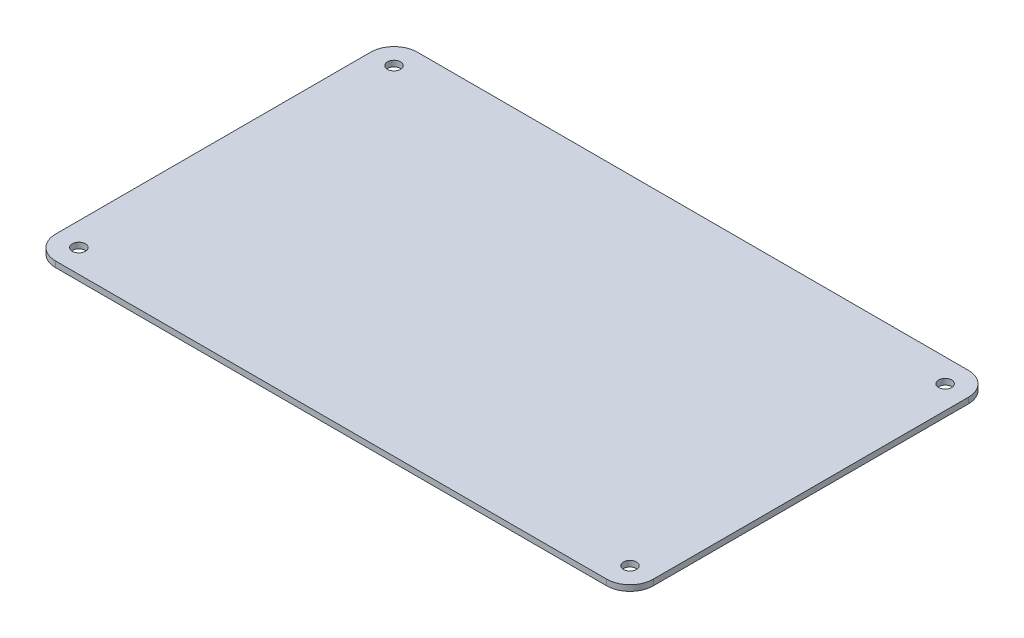
ISO-10303-21;
HEADER;
FILE_DESCRIPTION(('STEP AP214'),'2;1');
FILE_NAME('part.step','',(''),(''),'','','');
FILE_SCHEMA(('AUTOMOTIVE_DESIGN { 1 0 10303 214 1 1 1 1 }'));
ENDSEC;
DATA;
#1=APPLICATION_CONTEXT('core data for automotive mechanical design processes');
#2=APPLICATION_PROTOCOL_DEFINITION('international standard','automotive_design',2000,#1);
#3=PRODUCT_CONTEXT('',#1,'mechanical');
#4=PRODUCT('Part','Part','',(#3));
#5=PRODUCT_RELATED_PRODUCT_CATEGORY('part','',(#4));
#6=PRODUCT_DEFINITION_FORMATION('','',#4);
#7=PRODUCT_DEFINITION_CONTEXT('part definition',#1,'design');
#8=PRODUCT_DEFINITION('design','',#6,#7);
#9=PRODUCT_DEFINITION_SHAPE('','',#8);
#10=(LENGTH_UNIT() NAMED_UNIT(*) SI_UNIT(.MILLI.,.METRE.));
#11=(NAMED_UNIT(*) PLANE_ANGLE_UNIT() SI_UNIT($,.RADIAN.));
#12=(NAMED_UNIT(*) SI_UNIT($,.STERADIAN.) SOLID_ANGLE_UNIT());
#13=UNCERTAINTY_MEASURE_WITH_UNIT(LENGTH_MEASURE(1.E-05),#10,'distance_accuracy_value','');
#14=(GEOMETRIC_REPRESENTATION_CONTEXT(3) GLOBAL_UNCERTAINTY_ASSIGNED_CONTEXT((#13)) GLOBAL_UNIT_ASSIGNED_CONTEXT((#10,
#11,#12)) REPRESENTATION_CONTEXT('',''));
#15=CARTESIAN_POINT('',(0.,0.,0.));
#16=DIRECTION('',(0.,0.,1.));
#17=DIRECTION('',(1.,0.,0.));
#18=AXIS2_PLACEMENT_3D('',#15,#16,#17);
#19=CARTESIAN_POINT('',(-150.2918,3.175,-85.93963));
#20=DIRECTION('',(0.,-1.,0.));
#21=DIRECTION('',(0.,0.,-1.));
#22=AXIS2_PLACEMENT_3D('',#19,#20,#21);
#23=CYLINDRICAL_SURFACE('',#22,12.7);
#24=CARTESIAN_POINT('',(-150.2918,0.,-85.93963));
#25=DIRECTION('',(0.,1.,0.));
#26=DIRECTION('',(0.,0.,1.));
#27=AXIS2_PLACEMENT_3D('',#24,#25,#26);
#28=CIRCLE('',#27,12.7);
#29=CARTESIAN_POINT('',(-150.2918,0.,-98.63963));
#30=VERTEX_POINT('',#29);
#31=CARTESIAN_POINT('',(-162.9918,0.,-85.93963));
#32=VERTEX_POINT('',#31);
#33=EDGE_CURVE('E133',#30,#32,#28,.T.);
#34=ORIENTED_EDGE('',*,*,#33,.T.);
#35=DIRECTION('',(0.,-1.,0.));
#36=VECTOR('',#35,1.);
#37=CARTESIAN_POINT('',(-162.9918,3.175,-85.93963));
#38=LINE('',#37,#36);
#39=CARTESIAN_POINT('',(-162.9918,3.175,-85.93963));
#40=VERTEX_POINT('',#39);
#41=EDGE_CURVE('E11',#40,#32,#38,.T.);
#42=ORIENTED_EDGE('',*,*,#41,.F.);
#43=CARTESIAN_POINT('',(-150.2918,3.175,-85.93963));
#44=DIRECTION('',(0.,1.,0.));
#45=DIRECTION('',(0.,0.,1.));
#46=AXIS2_PLACEMENT_3D('',#43,#44,#45);
#47=CIRCLE('',#46,12.7);
#48=CARTESIAN_POINT('',(-150.2918,3.175,-98.63963));
#49=VERTEX_POINT('',#48);
#50=EDGE_CURVE('E148',#49,#40,#47,.T.);
#51=ORIENTED_EDGE('',*,*,#50,.F.);
#52=DIRECTION('',(0.,-1.,0.));
#53=VECTOR('',#52,1.);
#54=CARTESIAN_POINT('',(-150.2918,3.175,-98.63963));
#55=LINE('',#54,#53);
#56=EDGE_CURVE('E129',#49,#30,#55,.T.);
#57=ORIENTED_EDGE('',*,*,#56,.T.);
#58=EDGE_LOOP('',(#34,#42,#51,#57));
#59=FACE_BOUND('',#58,.T.);
#60=ADVANCED_FACE('F37',(#59),#23,.T.);
#61=CARTESIAN_POINT('',(-162.9918,3.175,-85.93963));
#62=DIRECTION('',(1.,0.,0.));
#63=DIRECTION('',(0.,0.,-1.));
#64=AXIS2_PLACEMENT_3D('',#61,#62,#63);
#65=PLANE('',#64);
#66=DIRECTION('',(0.,0.,1.));
#67=VECTOR('',#66,1.);
#68=CARTESIAN_POINT('',(-162.9918,0.,-85.93963));
#69=LINE('',#68,#67);
#70=CARTESIAN_POINT('',(-162.9918,0.,85.93963));
#71=VERTEX_POINT('',#70);
#72=EDGE_CURVE('E136',#32,#71,#69,.T.);
#73=ORIENTED_EDGE('',*,*,#72,.T.);
#74=DIRECTION('',(0.,-1.,0.));
#75=VECTOR('',#74,1.);
#76=CARTESIAN_POINT('',(-162.9918,3.175,85.93963));
#77=LINE('',#76,#75);
#78=CARTESIAN_POINT('',(-162.9918,3.175,85.93963));
#79=VERTEX_POINT('',#78);
#80=EDGE_CURVE('E45',#79,#71,#77,.T.);
#81=ORIENTED_EDGE('',*,*,#80,.F.);
#82=DIRECTION('',(0.,0.,1.));
#83=VECTOR('',#82,1.);
#84=CARTESIAN_POINT('',(-162.9918,3.175,-85.93963));
#85=LINE('',#84,#83);
#86=EDGE_CURVE('E96',#40,#79,#85,.T.);
#87=ORIENTED_EDGE('',*,*,#86,.F.);
#88=ORIENTED_EDGE('',*,*,#41,.T.);
#89=EDGE_LOOP('',(#73,#81,#87,#88));
#90=FACE_BOUND('',#89,.T.);
#91=ADVANCED_FACE('F233',(#90),#65,.F.);
#92=CARTESIAN_POINT('',(-150.2918,3.175,85.93963));
#93=DIRECTION('',(0.,-1.,0.));
#94=DIRECTION('',(0.,0.,-1.));
#95=AXIS2_PLACEMENT_3D('',#92,#93,#94);
#96=CYLINDRICAL_SURFACE('',#95,12.7);
#97=CARTESIAN_POINT('',(-150.2918,0.,85.93963));
#98=DIRECTION('',(0.,1.,0.));
#99=DIRECTION('',(0.,0.,-1.));
#100=AXIS2_PLACEMENT_3D('',#97,#98,#99);
#101=CIRCLE('',#100,12.7);
#102=CARTESIAN_POINT('',(-150.2918,0.,98.63963));
#103=VERTEX_POINT('',#102);
#104=EDGE_CURVE('E139',#71,#103,#101,.T.);
#105=ORIENTED_EDGE('',*,*,#104,.T.);
#106=DIRECTION('',(0.,-1.,0.));
#107=VECTOR('',#106,1.);
#108=CARTESIAN_POINT('',(-150.2918,3.175,98.63963));
#109=LINE('',#108,#107);
#110=CARTESIAN_POINT('',(-150.2918,3.175,98.63963));
#111=VERTEX_POINT('',#110);
#112=EDGE_CURVE('E155',#111,#103,#109,.T.);
#113=ORIENTED_EDGE('',*,*,#112,.F.);
#114=CARTESIAN_POINT('',(-150.2918,3.175,85.93963));
#115=DIRECTION('',(0.,1.,0.));
#116=DIRECTION('',(0.,0.,-1.));
#117=AXIS2_PLACEMENT_3D('',#114,#115,#116);
#118=CIRCLE('',#117,12.7);
#119=EDGE_CURVE('E163',#79,#111,#118,.T.);
#120=ORIENTED_EDGE('',*,*,#119,.F.);
#121=ORIENTED_EDGE('',*,*,#80,.T.);
#122=EDGE_LOOP('',(#105,#113,#120,#121));
#123=FACE_BOUND('',#122,.T.);
#124=ADVANCED_FACE('F161',(#123),#96,.T.);
#125=CARTESIAN_POINT('',(-150.2918,3.175,98.63963));
#126=DIRECTION('',(0.,0.,-1.));
#127=DIRECTION('',(-1.,0.,0.));
#128=AXIS2_PLACEMENT_3D('',#125,#126,#127);
#129=PLANE('',#128);
#130=DIRECTION('',(1.,0.,0.));
#131=VECTOR('',#130,1.);
#132=CARTESIAN_POINT('',(-150.2918,0.,98.63963));
#133=LINE('',#132,#131);
#134=CARTESIAN_POINT('',(150.2918,0.,98.63963));
#135=VERTEX_POINT('',#134);
#136=EDGE_CURVE('E141',#103,#135,#133,.T.);
#137=ORIENTED_EDGE('',*,*,#136,.T.);
#138=DIRECTION('',(0.,-1.,0.));
#139=VECTOR('',#138,1.);
#140=CARTESIAN_POINT('',(150.2918,3.175,98.63963));
#141=LINE('',#140,#139);
#142=CARTESIAN_POINT('',(150.2918,3.175,98.63963));
#143=VERTEX_POINT('',#142);
#144=EDGE_CURVE('E152',#143,#135,#141,.T.);
#145=ORIENTED_EDGE('',*,*,#144,.F.);
#146=DIRECTION('',(1.,0.,0.));
#147=VECTOR('',#146,1.);
#148=CARTESIAN_POINT('',(-150.2918,3.175,98.63963));
#149=LINE('',#148,#147);
#150=EDGE_CURVE('E175',#111,#143,#149,.T.);
#151=ORIENTED_EDGE('',*,*,#150,.F.);
#152=ORIENTED_EDGE('',*,*,#112,.T.);
#153=EDGE_LOOP('',(#137,#145,#151,#152));
#154=FACE_BOUND('',#153,.T.);
#155=ADVANCED_FACE('F171',(#154),#129,.F.);
#156=CARTESIAN_POINT('',(150.2918,3.175,85.93963));
#157=DIRECTION('',(0.,-1.,0.));
#158=DIRECTION('',(0.,0.,-1.));
#159=AXIS2_PLACEMENT_3D('',#156,#157,#158);
#160=CYLINDRICAL_SURFACE('',#159,12.7);
#161=CARTESIAN_POINT('',(150.2918,0.,85.93963));
#162=DIRECTION('',(0.,1.,0.));
#163=DIRECTION('',(0.,0.,1.));
#164=AXIS2_PLACEMENT_3D('',#161,#162,#163);
#165=CIRCLE('',#164,12.7);
#166=CARTESIAN_POINT('',(162.9918,0.,85.93963));
#167=VERTEX_POINT('',#166);
#168=EDGE_CURVE('E143',#135,#167,#165,.T.);
#169=ORIENTED_EDGE('',*,*,#168,.T.);
#170=DIRECTION('',(0.,-1.,0.));
#171=VECTOR('',#170,1.);
#172=CARTESIAN_POINT('',(162.9918,3.175,85.93963));
#173=LINE('',#172,#171);
#174=CARTESIAN_POINT('',(162.9918,3.175,85.93963));
#175=VERTEX_POINT('',#174);
#176=EDGE_CURVE('E124',#175,#167,#173,.T.);
#177=ORIENTED_EDGE('',*,*,#176,.F.);
#178=CARTESIAN_POINT('',(150.2918,3.175,85.93963));
#179=DIRECTION('',(0.,1.,0.));
#180=DIRECTION('',(0.,0.,1.));
#181=AXIS2_PLACEMENT_3D('',#178,#179,#180);
#182=CIRCLE('',#181,12.7);
#183=EDGE_CURVE('E115',#143,#175,#182,.T.);
#184=ORIENTED_EDGE('',*,*,#183,.F.);
#185=ORIENTED_EDGE('',*,*,#144,.T.);
#186=EDGE_LOOP('',(#169,#177,#184,#185));
#187=FACE_BOUND('',#186,.T.);
#188=ADVANCED_FACE('F174',(#187),#160,.T.);
#189=CARTESIAN_POINT('',(162.9918,3.175,-85.9396299999999));
#190=DIRECTION('',(-1.,0.,0.));
#191=DIRECTION('',(0.,0.,1.));
#192=AXIS2_PLACEMENT_3D('',#189,#190,#191);
#193=PLANE('',#192);
#194=DIRECTION('',(0.,0.,-1.));
#195=VECTOR('',#194,1.);
#196=CARTESIAN_POINT('',(162.9918,0.,-85.9396299999999));
#197=LINE('',#196,#195);
#198=CARTESIAN_POINT('',(162.9918,0.,-85.9396299999999));
#199=VERTEX_POINT('',#198);
#200=EDGE_CURVE('E123',#167,#199,#197,.T.);
#201=ORIENTED_EDGE('',*,*,#200,.T.);
#202=DIRECTION('',(0.,-1.,0.));
#203=VECTOR('',#202,1.);
#204=CARTESIAN_POINT('',(162.9918,3.175,-85.9396299999999));
#205=LINE('',#204,#203);
#206=CARTESIAN_POINT('',(162.9918,3.175,-85.9396299999999));
#207=VERTEX_POINT('',#206);
#208=EDGE_CURVE('E120',#207,#199,#205,.T.);
#209=ORIENTED_EDGE('',*,*,#208,.F.);
#210=DIRECTION('',(0.,0.,-1.));
#211=VECTOR('',#210,1.);
#212=CARTESIAN_POINT('',(162.9918,3.175,-85.9396299999999));
#213=LINE('',#212,#211);
#214=EDGE_CURVE('E109',#175,#207,#213,.T.);
#215=ORIENTED_EDGE('',*,*,#214,.F.);
#216=ORIENTED_EDGE('',*,*,#176,.T.);
#217=EDGE_LOOP('',(#201,#209,#215,#216));
#218=FACE_BOUND('',#217,.T.);
#219=ADVANCED_FACE('F121',(#218),#193,.F.);
#220=CARTESIAN_POINT('',(150.2918,3.175,-85.93963));
#221=DIRECTION('',(0.,-1.,0.));
#222=DIRECTION('',(0.,0.,-1.));
#223=AXIS2_PLACEMENT_3D('',#220,#221,#222);
#224=CYLINDRICAL_SURFACE('',#223,12.7);
#225=CARTESIAN_POINT('',(150.2918,0.,-85.93963));
#226=DIRECTION('',(0.,1.,0.));
#227=DIRECTION('',(0.,0.,-1.));
#228=AXIS2_PLACEMENT_3D('',#225,#226,#227);
#229=CIRCLE('',#228,12.7);
#230=CARTESIAN_POINT('',(150.2918,0.,-98.6396299999999));
#231=VERTEX_POINT('',#230);
#232=EDGE_CURVE('E82',#199,#231,#229,.T.);
#233=ORIENTED_EDGE('',*,*,#232,.T.);
#234=DIRECTION('',(0.,-1.,0.));
#235=VECTOR('',#234,1.);
#236=CARTESIAN_POINT('',(150.2918,3.175,-98.6396299999999));
#237=LINE('',#236,#235);
#238=CARTESIAN_POINT('',(150.2918,3.175,-98.6396299999999));
#239=VERTEX_POINT('',#238);
#240=EDGE_CURVE('E125',#239,#231,#237,.T.);
#241=ORIENTED_EDGE('',*,*,#240,.F.);
#242=CARTESIAN_POINT('',(150.2918,3.175,-85.93963));
#243=DIRECTION('',(0.,1.,0.));
#244=DIRECTION('',(0.,0.,-1.));
#245=AXIS2_PLACEMENT_3D('',#242,#243,#244);
#246=CIRCLE('',#245,12.7);
#247=EDGE_CURVE('E113',#207,#239,#246,.T.);
#248=ORIENTED_EDGE('',*,*,#247,.F.);
#249=ORIENTED_EDGE('',*,*,#208,.T.);
#250=EDGE_LOOP('',(#233,#241,#248,#249));
#251=FACE_BOUND('',#250,.T.);
#252=ADVANCED_FACE('F127',(#251),#224,.T.);
#253=CARTESIAN_POINT('',(-150.2918,3.175,-98.63963));
#254=DIRECTION('',(0.,0.,1.));
#255=DIRECTION('',(1.,0.,0.));
#256=AXIS2_PLACEMENT_3D('',#253,#254,#255);
#257=PLANE('',#256);
#258=DIRECTION('',(-1.,0.,0.));
#259=VECTOR('',#258,1.);
#260=CARTESIAN_POINT('',(-150.2918,0.,-98.63963));
#261=LINE('',#260,#259);
#262=EDGE_CURVE('E88',#231,#30,#261,.T.);
#263=ORIENTED_EDGE('',*,*,#262,.T.);
#264=ORIENTED_EDGE('',*,*,#56,.F.);
#265=DIRECTION('',(-1.,0.,0.));
#266=VECTOR('',#265,1.);
#267=CARTESIAN_POINT('',(-150.2918,3.175,-98.63963));
#268=LINE('',#267,#266);
#269=EDGE_CURVE('E53',#239,#49,#268,.T.);
#270=ORIENTED_EDGE('',*,*,#269,.F.);
#271=ORIENTED_EDGE('',*,*,#240,.T.);
#272=EDGE_LOOP('',(#263,#264,#270,#271));
#273=FACE_BOUND('',#272,.T.);
#274=ADVANCED_FACE('F209',(#273),#257,.F.);
#275=CARTESIAN_POINT('',(-150.2918,3.175,-85.93963));
#276=DIRECTION('',(0.,1.,0.));
#277=DIRECTION('',(0.,0.,1.));
#278=AXIS2_PLACEMENT_3D('',#275,#276,#277);
#279=PLANE('',#278);
#280=CARTESIAN_POINT('',(-150.2918,3.175,-85.93963));
#281=DIRECTION('',(0.,1.,0.));
#282=DIRECTION('',(0.,0.,1.));
#283=AXIS2_PLACEMENT_3D('',#280,#281,#282);
#284=CIRCLE('',#283,3.57123999999998);
#285=CARTESIAN_POINT('',(-150.2918,3.175,-82.36839));
#286=VERTEX_POINT('',#285);
#287=EDGE_CURVE('E201',#286,#286,#284,.T.);
#288=ORIENTED_EDGE('',*,*,#287,.F.);
#289=EDGE_LOOP('',(#288));
#290=FACE_BOUND('',#289,.T.);
#291=CARTESIAN_POINT('',(150.2918,3.175,-85.93963));
#292=DIRECTION('',(0.,1.,0.));
#293=DIRECTION('',(0.,0.,1.));
#294=AXIS2_PLACEMENT_3D('',#291,#292,#293);
#295=CIRCLE('',#294,3.57123999999998);
#296=CARTESIAN_POINT('',(150.2918,3.175,-82.36839));
#297=VERTEX_POINT('',#296);
#298=EDGE_CURVE('E195',#297,#297,#295,.T.);
#299=ORIENTED_EDGE('',*,*,#298,.F.);
#300=EDGE_LOOP('',(#299));
#301=FACE_BOUND('',#300,.T.);
#302=CARTESIAN_POINT('',(150.2918,3.175,85.93963));
#303=DIRECTION('',(0.,1.,0.));
#304=DIRECTION('',(0.,0.,1.));
#305=AXIS2_PLACEMENT_3D('',#302,#303,#304);
#306=CIRCLE('',#305,3.57123999999998);
#307=CARTESIAN_POINT('',(150.2918,3.175,89.51087));
#308=VERTEX_POINT('',#307);
#309=EDGE_CURVE('E189',#308,#308,#306,.T.);
#310=ORIENTED_EDGE('',*,*,#309,.F.);
#311=EDGE_LOOP('',(#310));
#312=FACE_BOUND('',#311,.T.);
#313=CARTESIAN_POINT('',(-150.2918,3.175,85.93963));
#314=DIRECTION('',(0.,1.,0.));
#315=DIRECTION('',(0.,0.,1.));
#316=AXIS2_PLACEMENT_3D('',#313,#314,#315);
#317=CIRCLE('',#316,3.57123999999998);
#318=CARTESIAN_POINT('',(-150.2918,3.175,89.51087));
#319=VERTEX_POINT('',#318);
#320=EDGE_CURVE('E183',#319,#319,#317,.T.);
#321=ORIENTED_EDGE('',*,*,#320,.F.);
#322=EDGE_LOOP('',(#321));
#323=FACE_BOUND('',#322,.T.);
#324=ORIENTED_EDGE('',*,*,#50,.T.);
#325=ORIENTED_EDGE('',*,*,#86,.T.);
#326=ORIENTED_EDGE('',*,*,#119,.T.);
#327=ORIENTED_EDGE('',*,*,#150,.T.);
#328=ORIENTED_EDGE('',*,*,#183,.T.);
#329=ORIENTED_EDGE('',*,*,#214,.T.);
#330=ORIENTED_EDGE('',*,*,#247,.T.);
#331=ORIENTED_EDGE('',*,*,#269,.T.);
#332=EDGE_LOOP('',(#324,#325,#326,#327,#328,#329,#330,#331));
#333=FACE_BOUND('',#332,.T.);
#334=ADVANCED_FACE('F111',(#290,#301,#312,#323,#333),#279,.T.);
#335=CARTESIAN_POINT('',(-150.2918,0.,-85.93963));
#336=DIRECTION('',(0.,1.,0.));
#337=DIRECTION('',(0.,0.,1.));
#338=AXIS2_PLACEMENT_3D('',#335,#336,#337);
#339=PLANE('',#338);
#340=CARTESIAN_POINT('',(-150.2918,0.,-85.93963));
#341=DIRECTION('',(0.,1.,0.));
#342=DIRECTION('',(0.,0.,1.));
#343=AXIS2_PLACEMENT_3D('',#340,#341,#342);
#344=CIRCLE('',#343,3.57124);
#345=CARTESIAN_POINT('',(-150.2918,0.,-82.36839));
#346=VERTEX_POINT('',#345);
#347=EDGE_CURVE('E198',#346,#346,#344,.T.);
#348=ORIENTED_EDGE('',*,*,#347,.T.);
#349=EDGE_LOOP('',(#348));
#350=FACE_BOUND('',#349,.T.);
#351=CARTESIAN_POINT('',(150.2918,0.,-85.93963));
#352=DIRECTION('',(0.,1.,0.));
#353=DIRECTION('',(0.,0.,1.));
#354=AXIS2_PLACEMENT_3D('',#351,#352,#353);
#355=CIRCLE('',#354,3.57124);
#356=CARTESIAN_POINT('',(150.2918,0.,-82.36839));
#357=VERTEX_POINT('',#356);
#358=EDGE_CURVE('E192',#357,#357,#355,.T.);
#359=ORIENTED_EDGE('',*,*,#358,.T.);
#360=EDGE_LOOP('',(#359));
#361=FACE_BOUND('',#360,.T.);
#362=CARTESIAN_POINT('',(150.2918,0.,85.93963));
#363=DIRECTION('',(0.,1.,0.));
#364=DIRECTION('',(0.,0.,1.));
#365=AXIS2_PLACEMENT_3D('',#362,#363,#364);
#366=CIRCLE('',#365,3.57124);
#367=CARTESIAN_POINT('',(150.2918,0.,89.51087));
#368=VERTEX_POINT('',#367);
#369=EDGE_CURVE('E186',#368,#368,#366,.T.);
#370=ORIENTED_EDGE('',*,*,#369,.T.);
#371=EDGE_LOOP('',(#370));
#372=FACE_BOUND('',#371,.T.);
#373=CARTESIAN_POINT('',(-150.2918,0.,85.93963));
#374=DIRECTION('',(0.,1.,0.));
#375=DIRECTION('',(0.,0.,1.));
#376=AXIS2_PLACEMENT_3D('',#373,#374,#375);
#377=CIRCLE('',#376,3.57124);
#378=CARTESIAN_POINT('',(-150.2918,0.,89.51087));
#379=VERTEX_POINT('',#378);
#380=EDGE_CURVE('E137',#379,#379,#377,.T.);
#381=ORIENTED_EDGE('',*,*,#380,.T.);
#382=EDGE_LOOP('',(#381));
#383=FACE_BOUND('',#382,.T.);
#384=ORIENTED_EDGE('',*,*,#33,.F.);
#385=ORIENTED_EDGE('',*,*,#262,.F.);
#386=ORIENTED_EDGE('',*,*,#232,.F.);
#387=ORIENTED_EDGE('',*,*,#200,.F.);
#388=ORIENTED_EDGE('',*,*,#168,.F.);
#389=ORIENTED_EDGE('',*,*,#136,.F.);
#390=ORIENTED_EDGE('',*,*,#104,.F.);
#391=ORIENTED_EDGE('',*,*,#72,.F.);
#392=EDGE_LOOP('',(#384,#385,#386,#387,#388,#389,#390,#391));
#393=FACE_BOUND('',#392,.T.);
#394=ADVANCED_FACE('F167',(#350,#361,#372,#383,#393),#339,.F.);
#395=CARTESIAN_POINT('',(-150.2918,3.175,85.93963));
#396=DIRECTION('',(0.,1.,0.));
#397=DIRECTION('',(0.,0.,1.));
#398=AXIS2_PLACEMENT_3D('',#395,#396,#397);
#399=CYLINDRICAL_SURFACE('',#398,3.57123999999999);
#400=ORIENTED_EDGE('',*,*,#380,.F.);
#401=EDGE_LOOP('',(#400));
#402=FACE_BOUND('',#401,.T.);
#403=ORIENTED_EDGE('',*,*,#320,.T.);
#404=EDGE_LOOP('',(#403));
#405=FACE_BOUND('',#404,.T.);
#406=ADVANCED_FACE('F217',(#402,#405),#399,.F.);
#407=CARTESIAN_POINT('',(150.2918,3.175,85.93963));
#408=DIRECTION('',(0.,1.,0.));
#409=DIRECTION('',(0.,0.,1.));
#410=AXIS2_PLACEMENT_3D('',#407,#408,#409);
#411=CYLINDRICAL_SURFACE('',#410,3.57123999999999);
#412=ORIENTED_EDGE('',*,*,#369,.F.);
#413=EDGE_LOOP('',(#412));
#414=FACE_BOUND('',#413,.T.);
#415=ORIENTED_EDGE('',*,*,#309,.T.);
#416=EDGE_LOOP('',(#415));
#417=FACE_BOUND('',#416,.T.);
#418=ADVANCED_FACE('F219',(#414,#417),#411,.F.);
#419=CARTESIAN_POINT('',(150.2918,3.175,-85.93963));
#420=DIRECTION('',(0.,1.,0.));
#421=DIRECTION('',(0.,0.,1.));
#422=AXIS2_PLACEMENT_3D('',#419,#420,#421);
#423=CYLINDRICAL_SURFACE('',#422,3.57123999999999);
#424=ORIENTED_EDGE('',*,*,#358,.F.);
#425=EDGE_LOOP('',(#424));
#426=FACE_BOUND('',#425,.T.);
#427=ORIENTED_EDGE('',*,*,#298,.T.);
#428=EDGE_LOOP('',(#427));
#429=FACE_BOUND('',#428,.T.);
#430=ADVANCED_FACE('F226',(#426,#429),#423,.F.);
#431=CARTESIAN_POINT('',(-150.2918,3.175,-85.93963));
#432=DIRECTION('',(0.,1.,0.));
#433=DIRECTION('',(0.,0.,1.));
#434=AXIS2_PLACEMENT_3D('',#431,#432,#433);
#435=CYLINDRICAL_SURFACE('',#434,3.57123999999999);
#436=ORIENTED_EDGE('',*,*,#347,.F.);
#437=EDGE_LOOP('',(#436));
#438=FACE_BOUND('',#437,.T.);
#439=ORIENTED_EDGE('',*,*,#287,.T.);
#440=EDGE_LOOP('',(#439));
#441=FACE_BOUND('',#440,.T.);
#442=ADVANCED_FACE('F205',(#438,#441),#435,.F.);
#443=CLOSED_SHELL('',(#60,#91,#124,#155,#188,#219,#252,#274,#334,#394,#406,#418,#430,#442));
#444=MANIFOLD_SOLID_BREP('B2',#443);
#445=ADVANCED_BREP_SHAPE_REPRESENTATION('',(#18,#444),#14);
#446=SHAPE_DEFINITION_REPRESENTATION(#9,#445);
ENDSEC;
END-ISO-10303-21;
